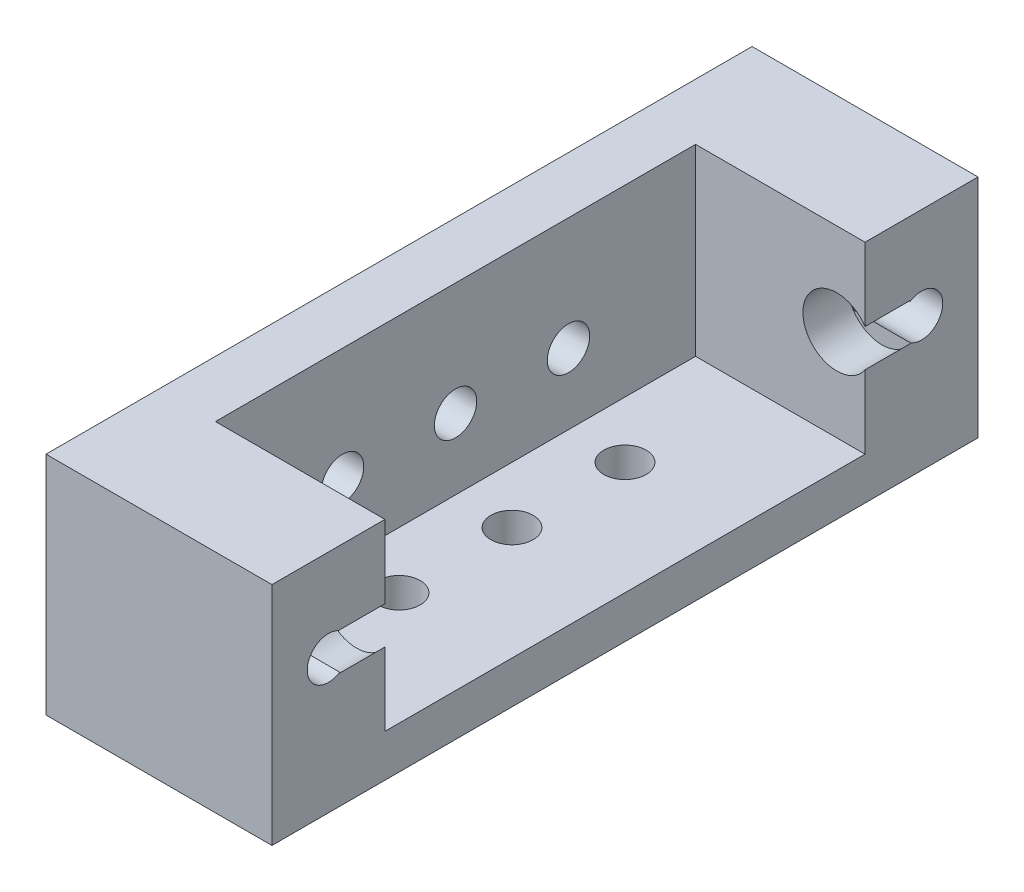
ISO-10303-21;
HEADER;
FILE_DESCRIPTION(('STEP AP214'),'2;1');
FILE_NAME('part.step','',(''),(''),'','','');
FILE_SCHEMA(('AUTOMOTIVE_DESIGN { 1 0 10303 214 1 1 1 1 }'));
ENDSEC;
DATA;
#1=APPLICATION_CONTEXT('core data for automotive mechanical design processes');
#2=APPLICATION_PROTOCOL_DEFINITION('international standard','automotive_design',2000,#1);
#3=PRODUCT_CONTEXT('',#1,'mechanical');
#4=PRODUCT('Part','Part','',(#3));
#5=PRODUCT_RELATED_PRODUCT_CATEGORY('part','',(#4));
#6=PRODUCT_DEFINITION_FORMATION('','',#4);
#7=PRODUCT_DEFINITION_CONTEXT('part definition',#1,'design');
#8=PRODUCT_DEFINITION('design','',#6,#7);
#9=PRODUCT_DEFINITION_SHAPE('','',#8);
#10=(LENGTH_UNIT() NAMED_UNIT(*) SI_UNIT(.MILLI.,.METRE.));
#11=(NAMED_UNIT(*) PLANE_ANGLE_UNIT() SI_UNIT($,.RADIAN.));
#12=(NAMED_UNIT(*) SI_UNIT($,.STERADIAN.) SOLID_ANGLE_UNIT());
#13=UNCERTAINTY_MEASURE_WITH_UNIT(LENGTH_MEASURE(1.E-05),#10,'distance_accuracy_value','');
#14=(GEOMETRIC_REPRESENTATION_CONTEXT(3) GLOBAL_UNCERTAINTY_ASSIGNED_CONTEXT((#13)) GLOBAL_UNIT_ASSIGNED_CONTEXT((#10,
#11,#12)) REPRESENTATION_CONTEXT('',''));
#15=CARTESIAN_POINT('',(0.,0.,0.));
#16=DIRECTION('',(0.,0.,1.));
#17=DIRECTION('',(1.,0.,0.));
#18=AXIS2_PLACEMENT_3D('',#15,#16,#17);
#19=CARTESIAN_POINT('',(25.4,0.,79.375));
#20=DIRECTION('',(-1.,0.,0.));
#21=DIRECTION('',(0.,0.,1.));
#22=AXIS2_PLACEMENT_3D('',#19,#20,#21);
#23=PLANE('',#22);
#24=DIRECTION('',(0.,1.,0.));
#25=VECTOR('',#24,1.);
#26=CARTESIAN_POINT('',(25.4,0.,71.755));
#27=LINE('',#26,#25);
#28=CARTESIAN_POINT('',(25.4,12.9751932581243,71.755));
#29=VERTEX_POINT('',#28);
#30=CARTESIAN_POINT('',(25.4,13.0669383154536,71.755));
#31=VERTEX_POINT('',#30);
#32=EDGE_CURVE('E172',#29,#31,#27,.T.);
#33=ORIENTED_EDGE('',*,*,#32,.T.);
#34=CARTESIAN_POINT('',(25.4,15.08125,73.025));
#35=DIRECTION('',(1.,0.,0.));
#36=DIRECTION('',(0.,0.,-1.));
#37=AXIS2_PLACEMENT_3D('',#34,#35,#36);
#38=CIRCLE('',#37,2.38125000000001);
#39=CARTESIAN_POINT('',(25.4,17.0955616845464,71.755));
#40=VERTEX_POINT('',#39);
#41=EDGE_CURVE('E158',#40,#31,#38,.T.);
#42=ORIENTED_EDGE('',*,*,#41,.F.);
#43=CARTESIAN_POINT('',(25.4,17.1873067418757,71.755));
#44=VERTEX_POINT('',#43);
#45=EDGE_CURVE('E169',#40,#44,#27,.T.);
#46=ORIENTED_EDGE('',*,*,#45,.T.);
#47=DIRECTION('',(0.,0.,-1.));
#48=VECTOR('',#47,1.);
#49=CARTESIAN_POINT('',(25.4,17.1873067418757,87.611307345283));
#50=LINE('',#49,#48);
#51=CARTESIAN_POINT('',(25.4,17.1873067418757,66.675));
#52=VERTEX_POINT('',#51);
#53=EDGE_CURVE('E314',#52,#44,#50,.F.);
#54=ORIENTED_EDGE('',*,*,#53,.F.);
#55=DIRECTION('',(0.,1.,0.));
#56=VECTOR('',#55,1.);
#57=CARTESIAN_POINT('',(25.4,-57.2381264979908,66.675));
#58=LINE('',#57,#56);
#59=CARTESIAN_POINT('',(25.4,25.4,66.675));
#60=VERTEX_POINT('',#59);
#61=EDGE_CURVE('E335',#52,#60,#58,.T.);
#62=ORIENTED_EDGE('',*,*,#61,.T.);
#63=DIRECTION('',(0.,0.,-1.));
#64=VECTOR('',#63,1.);
#65=CARTESIAN_POINT('',(25.4,25.4,79.375));
#66=LINE('',#65,#64);
#67=CARTESIAN_POINT('',(25.4,25.4,79.375));
#68=VERTEX_POINT('',#67);
#69=EDGE_CURVE('E260',#68,#60,#66,.T.);
#70=ORIENTED_EDGE('',*,*,#69,.F.);
#71=DIRECTION('',(0.,1.,0.));
#72=VECTOR('',#71,1.);
#73=CARTESIAN_POINT('',(25.4,0.,79.375));
#74=LINE('',#73,#72);
#75=CARTESIAN_POINT('',(25.4,0.,79.375));
#76=VERTEX_POINT('',#75);
#77=EDGE_CURVE('E259',#76,#68,#74,.T.);
#78=ORIENTED_EDGE('',*,*,#77,.F.);
#79=DIRECTION('',(0.,0.,-1.));
#80=VECTOR('',#79,1.);
#81=CARTESIAN_POINT('',(25.4,0.,79.375));
#82=LINE('',#81,#80);
#83=CARTESIAN_POINT('',(25.4,0.,0.));
#84=VERTEX_POINT('',#83);
#85=EDGE_CURVE('E244',#76,#84,#82,.T.);
#86=ORIENTED_EDGE('',*,*,#85,.T.);
#87=DIRECTION('',(0.,1.,0.));
#88=VECTOR('',#87,1.);
#89=CARTESIAN_POINT('',(25.4,0.,0.));
#90=LINE('',#89,#88);
#91=CARTESIAN_POINT('',(25.4,25.4,0.));
#92=VERTEX_POINT('',#91);
#93=EDGE_CURVE('E252',#84,#92,#90,.T.);
#94=ORIENTED_EDGE('',*,*,#93,.T.);
#95=CARTESIAN_POINT('',(25.4,25.4,12.7));
#96=VERTEX_POINT('',#95);
#97=EDGE_CURVE('E272',#96,#92,#66,.T.);
#98=ORIENTED_EDGE('',*,*,#97,.F.);
#99=DIRECTION('',(0.,1.,0.));
#100=VECTOR('',#99,1.);
#101=CARTESIAN_POINT('',(25.4,-57.2381264979908,12.7));
#102=LINE('',#101,#100);
#103=CARTESIAN_POINT('',(25.4,17.1873067418757,12.7));
#104=VERTEX_POINT('',#103);
#105=EDGE_CURVE('E311',#104,#96,#102,.T.);
#106=ORIENTED_EDGE('',*,*,#105,.F.);
#107=CARTESIAN_POINT('',(25.4,17.1873067418757,7.62));
#108=VERTEX_POINT('',#107);
#109=EDGE_CURVE('E307',#108,#104,#50,.F.);
#110=ORIENTED_EDGE('',*,*,#109,.F.);
#111=DIRECTION('',(0.,1.,0.));
#112=VECTOR('',#111,1.);
#113=CARTESIAN_POINT('',(25.4,0.,7.62));
#114=LINE('',#113,#112);
#115=CARTESIAN_POINT('',(25.4,17.0955616845464,7.62));
#116=VERTEX_POINT('',#115);
#117=EDGE_CURVE('E182',#116,#108,#114,.T.);
#118=ORIENTED_EDGE('',*,*,#117,.F.);
#119=CARTESIAN_POINT('',(25.4,15.08125,6.35));
#120=DIRECTION('',(1.,0.,0.));
#121=DIRECTION('',(0.,0.,-1.));
#122=AXIS2_PLACEMENT_3D('',#119,#120,#121);
#123=CIRCLE('',#122,2.38125);
#124=CARTESIAN_POINT('',(25.4,13.0669383154536,7.62));
#125=VERTEX_POINT('',#124);
#126=EDGE_CURVE('E173',#125,#116,#123,.T.);
#127=ORIENTED_EDGE('',*,*,#126,.F.);
#128=CARTESIAN_POINT('',(25.4,12.9751932581243,7.62));
#129=VERTEX_POINT('',#128);
#130=EDGE_CURVE('E179',#129,#125,#114,.T.);
#131=ORIENTED_EDGE('',*,*,#130,.F.);
#132=DIRECTION('',(0.,0.,-1.));
#133=VECTOR('',#132,1.);
#134=CARTESIAN_POINT('',(25.4,12.9751932581243,87.611307345283));
#135=LINE('',#134,#133);
#136=CARTESIAN_POINT('',(25.4,12.9751932581243,12.7));
#137=VERTEX_POINT('',#136);
#138=EDGE_CURVE('E308',#137,#129,#135,.T.);
#139=ORIENTED_EDGE('',*,*,#138,.F.);
#140=CARTESIAN_POINT('',(25.4,4.7625,12.7));
#141=VERTEX_POINT('',#140);
#142=EDGE_CURVE('E347',#141,#137,#102,.T.);
#143=ORIENTED_EDGE('',*,*,#142,.F.);
#144=DIRECTION('',(0.,0.,1.));
#145=VECTOR('',#144,1.);
#146=CARTESIAN_POINT('',(25.4,4.7625,12.7));
#147=LINE('',#146,#145);
#148=CARTESIAN_POINT('',(25.4,4.7625,66.675));
#149=VERTEX_POINT('',#148);
#150=EDGE_CURVE('E332',#141,#149,#147,.T.);
#151=ORIENTED_EDGE('',*,*,#150,.T.);
#152=CARTESIAN_POINT('',(25.4,12.9751932581243,66.675));
#153=VERTEX_POINT('',#152);
#154=EDGE_CURVE('E329',#149,#153,#58,.T.);
#155=ORIENTED_EDGE('',*,*,#154,.T.);
#156=EDGE_CURVE('E315',#29,#153,#135,.T.);
#157=ORIENTED_EDGE('',*,*,#156,.F.);
#158=EDGE_LOOP('',(#33,#42,#46,#54,#62,#70,#78,#86,#94,#98,#106,#110,#118,#127,#131,#139,#143,
#151,#155,#157));
#159=FACE_BOUND('',#158,.T.);
#160=ADVANCED_FACE('F44',(#159),#23,.F.);
#161=CARTESIAN_POINT('',(0.,0.,79.375));
#162=DIRECTION('',(1.,0.,0.));
#163=DIRECTION('',(0.,0.,-1.));
#164=AXIS2_PLACEMENT_3D('',#161,#162,#163);
#165=PLANE('',#164);
#166=CARTESIAN_POINT('',(0.,12.7,26.9875));
#167=DIRECTION('',(1.,0.,0.));
#168=DIRECTION('',(0.,0.,-1.));
#169=AXIS2_PLACEMENT_3D('',#166,#167,#168);
#170=CIRCLE('',#169,2.38125);
#171=CARTESIAN_POINT('',(0.,12.7,24.60625));
#172=VERTEX_POINT('',#171);
#173=EDGE_CURVE('E290',#172,#172,#170,.T.);
#174=ORIENTED_EDGE('',*,*,#173,.T.);
#175=EDGE_LOOP('',(#174));
#176=FACE_BOUND('',#175,.T.);
#177=CARTESIAN_POINT('',(0.,12.7,39.6875));
#178=DIRECTION('',(1.,0.,0.));
#179=DIRECTION('',(0.,0.,-1.));
#180=AXIS2_PLACEMENT_3D('',#177,#178,#179);
#181=CIRCLE('',#180,2.38125);
#182=CARTESIAN_POINT('',(0.,12.7,37.30625));
#183=VERTEX_POINT('',#182);
#184=EDGE_CURVE('E286',#183,#183,#181,.T.);
#185=ORIENTED_EDGE('',*,*,#184,.T.);
#186=EDGE_LOOP('',(#185));
#187=FACE_BOUND('',#186,.T.);
#188=CARTESIAN_POINT('',(0.,12.7,52.3875));
#189=DIRECTION('',(1.,0.,0.));
#190=DIRECTION('',(0.,0.,-1.));
#191=AXIS2_PLACEMENT_3D('',#188,#189,#190);
#192=CIRCLE('',#191,2.38125);
#193=CARTESIAN_POINT('',(0.,12.7,50.00625));
#194=VERTEX_POINT('',#193);
#195=EDGE_CURVE('E281',#194,#194,#192,.T.);
#196=ORIENTED_EDGE('',*,*,#195,.T.);
#197=EDGE_LOOP('',(#196));
#198=FACE_BOUND('',#197,.T.);
#199=DIRECTION('',(0.,-1.,0.));
#200=VECTOR('',#199,1.);
#201=CARTESIAN_POINT('',(0.,0.,0.));
#202=LINE('',#201,#200);
#203=CARTESIAN_POINT('',(0.,25.4,0.));
#204=VERTEX_POINT('',#203);
#205=CARTESIAN_POINT('',(0.,0.,0.));
#206=VERTEX_POINT('',#205);
#207=EDGE_CURVE('E253',#204,#206,#202,.T.);
#208=ORIENTED_EDGE('',*,*,#207,.T.);
#209=DIRECTION('',(0.,0.,-1.));
#210=VECTOR('',#209,1.);
#211=CARTESIAN_POINT('',(0.,0.,79.375));
#212=LINE('',#211,#210);
#213=CARTESIAN_POINT('',(0.,0.,79.375));
#214=VERTEX_POINT('',#213);
#215=EDGE_CURVE('E247',#214,#206,#212,.T.);
#216=ORIENTED_EDGE('',*,*,#215,.F.);
#217=DIRECTION('',(0.,-1.,0.));
#218=VECTOR('',#217,1.);
#219=CARTESIAN_POINT('',(0.,0.,79.375));
#220=LINE('',#219,#218);
#221=CARTESIAN_POINT('',(0.,25.4,79.375));
#222=VERTEX_POINT('',#221);
#223=EDGE_CURVE('E265',#222,#214,#220,.T.);
#224=ORIENTED_EDGE('',*,*,#223,.F.);
#225=DIRECTION('',(0.,0.,-1.));
#226=VECTOR('',#225,1.);
#227=CARTESIAN_POINT('',(0.,25.4,79.375));
#228=LINE('',#227,#226);
#229=EDGE_CURVE('E269',#222,#204,#228,.T.);
#230=ORIENTED_EDGE('',*,*,#229,.T.);
#231=EDGE_LOOP('',(#208,#216,#224,#230));
#232=FACE_BOUND('',#231,.T.);
#233=ADVANCED_FACE('F46',(#176,#187,#198,#232),#165,.F.);
#234=CARTESIAN_POINT('',(0.,0.,79.375));
#235=DIRECTION('',(0.,1.,0.));
#236=DIRECTION('',(0.,0.,1.));
#237=AXIS2_PLACEMENT_3D('',#234,#235,#236);
#238=PLANE('',#237);
#239=CARTESIAN_POINT('',(12.7,0.,52.3875));
#240=DIRECTION('',(0.,-1.,0.));
#241=DIRECTION('',(0.,0.,-1.));
#242=AXIS2_PLACEMENT_3D('',#239,#240,#241);
#243=CIRCLE('',#242,2.38125);
#244=CARTESIAN_POINT('',(12.7,0.,50.00625));
#245=VERTEX_POINT('',#244);
#246=EDGE_CURVE('E231',#245,#245,#243,.T.);
#247=ORIENTED_EDGE('',*,*,#246,.F.);
#248=EDGE_LOOP('',(#247));
#249=FACE_BOUND('',#248,.T.);
#250=CARTESIAN_POINT('',(12.7,0.,39.6875));
#251=DIRECTION('',(0.,-1.,0.));
#252=DIRECTION('',(0.,0.,-1.));
#253=AXIS2_PLACEMENT_3D('',#250,#251,#252);
#254=CIRCLE('',#253,2.38125);
#255=CARTESIAN_POINT('',(12.7,0.,37.30625));
#256=VERTEX_POINT('',#255);
#257=EDGE_CURVE('E235',#256,#256,#254,.T.);
#258=ORIENTED_EDGE('',*,*,#257,.F.);
#259=EDGE_LOOP('',(#258));
#260=FACE_BOUND('',#259,.T.);
#261=CARTESIAN_POINT('',(12.7,0.,26.9875));
#262=DIRECTION('',(0.,-1.,0.));
#263=DIRECTION('',(0.,0.,-1.));
#264=AXIS2_PLACEMENT_3D('',#261,#262,#263);
#265=CIRCLE('',#264,2.38125);
#266=CARTESIAN_POINT('',(12.7,0.,24.60625));
#267=VERTEX_POINT('',#266);
#268=EDGE_CURVE('E239',#267,#267,#265,.T.);
#269=ORIENTED_EDGE('',*,*,#268,.F.);
#270=EDGE_LOOP('',(#269));
#271=FACE_BOUND('',#270,.T.);
#272=DIRECTION('',(1.,0.,0.));
#273=VECTOR('',#272,1.);
#274=CARTESIAN_POINT('',(0.,0.,0.));
#275=LINE('',#274,#273);
#276=EDGE_CURVE('E242',#206,#84,#275,.T.);
#277=ORIENTED_EDGE('',*,*,#276,.T.);
#278=ORIENTED_EDGE('',*,*,#85,.F.);
#279=DIRECTION('',(1.,0.,0.));
#280=VECTOR('',#279,1.);
#281=CARTESIAN_POINT('',(0.,0.,79.375));
#282=LINE('',#281,#280);
#283=EDGE_CURVE('E354',#214,#76,#282,.T.);
#284=ORIENTED_EDGE('',*,*,#283,.F.);
#285=ORIENTED_EDGE('',*,*,#215,.T.);
#286=EDGE_LOOP('',(#277,#278,#284,#285));
#287=FACE_BOUND('',#286,.T.);
#288=ADVANCED_FACE('F214',(#249,#260,#271,#287),#238,.F.);
#289=CARTESIAN_POINT('',(0.,25.4,79.375));
#290=DIRECTION('',(0.,-1.,0.));
#291=DIRECTION('',(0.,0.,-1.));
#292=AXIS2_PLACEMENT_3D('',#289,#290,#291);
#293=PLANE('',#292);
#294=ORIENTED_EDGE('',*,*,#69,.T.);
#295=DIRECTION('',(1.,0.,0.));
#296=VECTOR('',#295,1.);
#297=CARTESIAN_POINT('',(25.4,25.4,66.675));
#298=LINE('',#297,#296);
#299=CARTESIAN_POINT('',(6.35,25.4,66.675));
#300=VERTEX_POINT('',#299);
#301=EDGE_CURVE('E342',#300,#60,#298,.T.);
#302=ORIENTED_EDGE('',*,*,#301,.F.);
#303=DIRECTION('',(0.,0.,1.));
#304=VECTOR('',#303,1.);
#305=CARTESIAN_POINT('',(6.35,25.4,12.7));
#306=LINE('',#305,#304);
#307=CARTESIAN_POINT('',(6.35,25.4,12.7));
#308=VERTEX_POINT('',#307);
#309=EDGE_CURVE('E367',#308,#300,#306,.T.);
#310=ORIENTED_EDGE('',*,*,#309,.F.);
#311=DIRECTION('',(-1.,0.,0.));
#312=VECTOR('',#311,1.);
#313=CARTESIAN_POINT('',(25.4,25.4,12.7));
#314=LINE('',#313,#312);
#315=EDGE_CURVE('E364',#96,#308,#314,.T.);
#316=ORIENTED_EDGE('',*,*,#315,.F.);
#317=ORIENTED_EDGE('',*,*,#97,.T.);
#318=DIRECTION('',(-1.,0.,0.));
#319=VECTOR('',#318,1.);
#320=CARTESIAN_POINT('',(0.,25.4,0.));
#321=LINE('',#320,#319);
#322=EDGE_CURVE('E263',#92,#204,#321,.T.);
#323=ORIENTED_EDGE('',*,*,#322,.T.);
#324=ORIENTED_EDGE('',*,*,#229,.F.);
#325=DIRECTION('',(-1.,0.,0.));
#326=VECTOR('',#325,1.);
#327=CARTESIAN_POINT('',(0.,25.4,79.375));
#328=LINE('',#327,#326);
#329=EDGE_CURVE('E273',#68,#222,#328,.T.);
#330=ORIENTED_EDGE('',*,*,#329,.F.);
#331=EDGE_LOOP('',(#294,#302,#310,#316,#317,#323,#324,#330));
#332=FACE_BOUND('',#331,.T.);
#333=ADVANCED_FACE('F217',(#332),#293,.F.);
#334=CARTESIAN_POINT('',(0.,0.,79.375));
#335=DIRECTION('',(0.,0.,-1.));
#336=DIRECTION('',(-1.,0.,0.));
#337=AXIS2_PLACEMENT_3D('',#334,#335,#336);
#338=PLANE('',#337);
#339=ORIENTED_EDGE('',*,*,#223,.T.);
#340=ORIENTED_EDGE('',*,*,#283,.T.);
#341=ORIENTED_EDGE('',*,*,#77,.T.);
#342=ORIENTED_EDGE('',*,*,#329,.T.);
#343=EDGE_LOOP('',(#339,#340,#341,#342));
#344=FACE_BOUND('',#343,.T.);
#345=ADVANCED_FACE('F226',(#344),#338,.F.);
#346=CARTESIAN_POINT('',(0.,0.,0.));
#347=DIRECTION('',(0.,0.,-1.));
#348=DIRECTION('',(-1.,0.,0.));
#349=AXIS2_PLACEMENT_3D('',#346,#347,#348);
#350=PLANE('',#349);
#351=ORIENTED_EDGE('',*,*,#207,.F.);
#352=ORIENTED_EDGE('',*,*,#322,.F.);
#353=ORIENTED_EDGE('',*,*,#93,.F.);
#354=ORIENTED_EDGE('',*,*,#276,.F.);
#355=EDGE_LOOP('',(#351,#352,#353,#354));
#356=FACE_BOUND('',#355,.T.);
#357=ADVANCED_FACE('F262',(#356),#350,.T.);
#358=CARTESIAN_POINT('',(25.4,-57.2381264979908,66.675));
#359=DIRECTION('',(0.,0.,1.));
#360=DIRECTION('',(1.,0.,0.));
#361=AXIS2_PLACEMENT_3D('',#358,#359,#360);
#362=PLANE('',#361);
#363=CARTESIAN_POINT('',(22.225,15.08125,66.675));
#364=DIRECTION('',(0.,0.,1.));
#365=DIRECTION('',(1.,0.,0.));
#366=AXIS2_PLACEMENT_3D('',#363,#364,#365);
#367=CIRCLE('',#366,3.81);
#368=EDGE_CURVE('E312',#153,#52,#367,.F.);
#369=ORIENTED_EDGE('',*,*,#368,.F.);
#370=ORIENTED_EDGE('',*,*,#154,.F.);
#371=DIRECTION('',(-1.,0.,0.));
#372=VECTOR('',#371,1.);
#373=CARTESIAN_POINT('',(25.4,4.7625,66.675));
#374=LINE('',#373,#372);
#375=CARTESIAN_POINT('',(6.35,4.7625,66.675));
#376=VERTEX_POINT('',#375);
#377=EDGE_CURVE('E337',#149,#376,#374,.T.);
#378=ORIENTED_EDGE('',*,*,#377,.T.);
#379=DIRECTION('',(0.,1.,0.));
#380=VECTOR('',#379,1.);
#381=CARTESIAN_POINT('',(6.35,-57.2381264979908,66.675));
#382=LINE('',#381,#380);
#383=EDGE_CURVE('E339',#376,#300,#382,.T.);
#384=ORIENTED_EDGE('',*,*,#383,.T.);
#385=ORIENTED_EDGE('',*,*,#301,.T.);
#386=ORIENTED_EDGE('',*,*,#61,.F.);
#387=EDGE_LOOP('',(#369,#370,#378,#384,#385,#386));
#388=FACE_BOUND('',#387,.T.);
#389=ADVANCED_FACE('F416',(#388),#362,.F.);
#390=CARTESIAN_POINT('',(6.35,-57.2381264979908,12.7));
#391=DIRECTION('',(-1.,0.,0.));
#392=DIRECTION('',(0.,0.,1.));
#393=AXIS2_PLACEMENT_3D('',#390,#391,#392);
#394=PLANE('',#393);
#395=CARTESIAN_POINT('',(6.35,12.7,26.9875));
#396=DIRECTION('',(-1.,0.,0.));
#397=DIRECTION('',(0.,0.,1.));
#398=AXIS2_PLACEMENT_3D('',#395,#396,#397);
#399=CIRCLE('',#398,2.38125);
#400=CARTESIAN_POINT('',(6.35,12.7,29.36875));
#401=VERTEX_POINT('',#400);
#402=EDGE_CURVE('E287',#401,#401,#399,.T.);
#403=ORIENTED_EDGE('',*,*,#402,.T.);
#404=EDGE_LOOP('',(#403));
#405=FACE_BOUND('',#404,.T.);
#406=CARTESIAN_POINT('',(6.35,12.7,39.6875));
#407=DIRECTION('',(-1.,0.,0.));
#408=DIRECTION('',(0.,0.,1.));
#409=AXIS2_PLACEMENT_3D('',#406,#407,#408);
#410=CIRCLE('',#409,2.38125);
#411=CARTESIAN_POINT('',(6.35,12.7,42.06875));
#412=VERTEX_POINT('',#411);
#413=EDGE_CURVE('E283',#412,#412,#410,.T.);
#414=ORIENTED_EDGE('',*,*,#413,.T.);
#415=EDGE_LOOP('',(#414));
#416=FACE_BOUND('',#415,.T.);
#417=CARTESIAN_POINT('',(6.35,12.7,52.3875));
#418=DIRECTION('',(-1.,0.,0.));
#419=DIRECTION('',(0.,0.,1.));
#420=AXIS2_PLACEMENT_3D('',#417,#418,#419);
#421=CIRCLE('',#420,2.38125);
#422=CARTESIAN_POINT('',(6.35,12.7,54.76875));
#423=VERTEX_POINT('',#422);
#424=EDGE_CURVE('E278',#423,#423,#421,.T.);
#425=ORIENTED_EDGE('',*,*,#424,.T.);
#426=EDGE_LOOP('',(#425));
#427=FACE_BOUND('',#426,.T.);
#428=DIRECTION('',(0.,0.,-1.));
#429=VECTOR('',#428,1.);
#430=CARTESIAN_POINT('',(6.35,4.7625,12.7));
#431=LINE('',#430,#429);
#432=CARTESIAN_POINT('',(6.35,4.7625,12.7));
#433=VERTEX_POINT('',#432);
#434=EDGE_CURVE('E334',#376,#433,#431,.T.);
#435=ORIENTED_EDGE('',*,*,#434,.T.);
#436=DIRECTION('',(0.,1.,0.));
#437=VECTOR('',#436,1.);
#438=CARTESIAN_POINT('',(6.35,-57.2381264979908,12.7));
#439=LINE('',#438,#437);
#440=EDGE_CURVE('E345',#433,#308,#439,.T.);
#441=ORIENTED_EDGE('',*,*,#440,.T.);
#442=ORIENTED_EDGE('',*,*,#309,.T.);
#443=ORIENTED_EDGE('',*,*,#383,.F.);
#444=EDGE_LOOP('',(#435,#441,#442,#443));
#445=FACE_BOUND('',#444,.T.);
#446=ADVANCED_FACE('F418',(#405,#416,#427,#445),#394,.F.);
#447=CARTESIAN_POINT('',(25.4,-57.2381264979908,12.7));
#448=DIRECTION('',(0.,0.,-1.));
#449=DIRECTION('',(-1.,0.,0.));
#450=AXIS2_PLACEMENT_3D('',#447,#448,#449);
#451=PLANE('',#450);
#452=CARTESIAN_POINT('',(22.225,15.08125,12.7));
#453=DIRECTION('',(0.,0.,-1.));
#454=DIRECTION('',(-1.,0.,0.));
#455=AXIS2_PLACEMENT_3D('',#452,#453,#454);
#456=CIRCLE('',#455,3.81);
#457=EDGE_CURVE('E277',#104,#137,#456,.F.);
#458=ORIENTED_EDGE('',*,*,#457,.F.);
#459=ORIENTED_EDGE('',*,*,#105,.T.);
#460=ORIENTED_EDGE('',*,*,#315,.T.);
#461=ORIENTED_EDGE('',*,*,#440,.F.);
#462=DIRECTION('',(1.,0.,0.));
#463=VECTOR('',#462,1.);
#464=CARTESIAN_POINT('',(25.4,4.7625,12.7));
#465=LINE('',#464,#463);
#466=EDGE_CURVE('E350',#433,#141,#465,.T.);
#467=ORIENTED_EDGE('',*,*,#466,.T.);
#468=ORIENTED_EDGE('',*,*,#142,.T.);
#469=EDGE_LOOP('',(#458,#459,#460,#461,#467,#468));
#470=FACE_BOUND('',#469,.T.);
#471=ADVANCED_FACE('F414',(#470),#451,.F.);
#472=CARTESIAN_POINT('',(0.,4.7625,79.375));
#473=DIRECTION('',(0.,1.,0.));
#474=DIRECTION('',(0.,0.,1.));
#475=AXIS2_PLACEMENT_3D('',#472,#473,#474);
#476=PLANE('',#475);
#477=CARTESIAN_POINT('',(12.7,4.7625,52.3875));
#478=DIRECTION('',(0.,1.,0.));
#479=DIRECTION('',(0.,0.,1.));
#480=AXIS2_PLACEMENT_3D('',#477,#478,#479);
#481=CIRCLE('',#480,2.38125);
#482=CARTESIAN_POINT('',(12.7,4.7625,54.76875));
#483=VERTEX_POINT('',#482);
#484=EDGE_CURVE('E282',#483,#483,#481,.T.);
#485=ORIENTED_EDGE('',*,*,#484,.F.);
#486=EDGE_LOOP('',(#485));
#487=FACE_BOUND('',#486,.T.);
#488=CARTESIAN_POINT('',(12.7,4.7625,39.6875));
#489=DIRECTION('',(0.,1.,0.));
#490=DIRECTION('',(0.,0.,1.));
#491=AXIS2_PLACEMENT_3D('',#488,#489,#490);
#492=CIRCLE('',#491,2.38125);
#493=CARTESIAN_POINT('',(12.7,4.7625,42.06875));
#494=VERTEX_POINT('',#493);
#495=EDGE_CURVE('E294',#494,#494,#492,.T.);
#496=ORIENTED_EDGE('',*,*,#495,.F.);
#497=EDGE_LOOP('',(#496));
#498=FACE_BOUND('',#497,.T.);
#499=CARTESIAN_POINT('',(12.7,4.7625,26.9875));
#500=DIRECTION('',(0.,1.,0.));
#501=DIRECTION('',(0.,0.,1.));
#502=AXIS2_PLACEMENT_3D('',#499,#500,#501);
#503=CIRCLE('',#502,2.38125);
#504=CARTESIAN_POINT('',(12.7,4.7625,29.36875));
#505=VERTEX_POINT('',#504);
#506=EDGE_CURVE('E291',#505,#505,#503,.T.);
#507=ORIENTED_EDGE('',*,*,#506,.F.);
#508=EDGE_LOOP('',(#507));
#509=FACE_BOUND('',#508,.T.);
#510=ORIENTED_EDGE('',*,*,#150,.F.);
#511=ORIENTED_EDGE('',*,*,#466,.F.);
#512=ORIENTED_EDGE('',*,*,#434,.F.);
#513=ORIENTED_EDGE('',*,*,#377,.F.);
#514=EDGE_LOOP('',(#510,#511,#512,#513));
#515=FACE_BOUND('',#514,.T.);
#516=ADVANCED_FACE('F411',(#487,#498,#509,#515),#476,.T.);
#517=CARTESIAN_POINT('',(25.4,12.7,52.3875));
#518=DIRECTION('',(-1.,0.,0.));
#519=DIRECTION('',(0.,0.,1.));
#520=AXIS2_PLACEMENT_3D('',#517,#518,#519);
#521=CYLINDRICAL_SURFACE('',#520,2.38125);
#522=ORIENTED_EDGE('',*,*,#424,.F.);
#523=EDGE_LOOP('',(#522));
#524=FACE_BOUND('',#523,.T.);
#525=ORIENTED_EDGE('',*,*,#195,.F.);
#526=EDGE_LOOP('',(#525));
#527=FACE_BOUND('',#526,.T.);
#528=ADVANCED_FACE('F407',(#524,#527),#521,.F.);
#529=CARTESIAN_POINT('',(25.4,12.7,39.6875));
#530=DIRECTION('',(-1.,0.,0.));
#531=DIRECTION('',(0.,0.,1.));
#532=AXIS2_PLACEMENT_3D('',#529,#530,#531);
#533=CYLINDRICAL_SURFACE('',#532,2.38125);
#534=ORIENTED_EDGE('',*,*,#413,.F.);
#535=EDGE_LOOP('',(#534));
#536=FACE_BOUND('',#535,.T.);
#537=ORIENTED_EDGE('',*,*,#184,.F.);
#538=EDGE_LOOP('',(#537));
#539=FACE_BOUND('',#538,.T.);
#540=ADVANCED_FACE('F403',(#536,#539),#533,.F.);
#541=CARTESIAN_POINT('',(25.4,12.7,26.9875));
#542=DIRECTION('',(-1.,0.,0.));
#543=DIRECTION('',(0.,0.,1.));
#544=AXIS2_PLACEMENT_3D('',#541,#542,#543);
#545=CYLINDRICAL_SURFACE('',#544,2.38125);
#546=ORIENTED_EDGE('',*,*,#402,.F.);
#547=EDGE_LOOP('',(#546));
#548=FACE_BOUND('',#547,.T.);
#549=ORIENTED_EDGE('',*,*,#173,.F.);
#550=EDGE_LOOP('',(#549));
#551=FACE_BOUND('',#550,.T.);
#552=ADVANCED_FACE('F400',(#548,#551),#545,.F.);
#553=CARTESIAN_POINT('',(12.7,25.4,26.9875));
#554=DIRECTION('',(0.,-1.,0.));
#555=DIRECTION('',(0.,0.,-1.));
#556=AXIS2_PLACEMENT_3D('',#553,#554,#555);
#557=CYLINDRICAL_SURFACE('',#556,2.38125);
#558=ORIENTED_EDGE('',*,*,#506,.T.);
#559=EDGE_LOOP('',(#558));
#560=FACE_BOUND('',#559,.T.);
#561=ORIENTED_EDGE('',*,*,#268,.T.);
#562=EDGE_LOOP('',(#561));
#563=FACE_BOUND('',#562,.T.);
#564=ADVANCED_FACE('F393',(#560,#563),#557,.F.);
#565=CARTESIAN_POINT('',(12.7,25.4,39.6875));
#566=DIRECTION('',(0.,-1.,0.));
#567=DIRECTION('',(0.,0.,-1.));
#568=AXIS2_PLACEMENT_3D('',#565,#566,#567);
#569=CYLINDRICAL_SURFACE('',#568,2.38125);
#570=ORIENTED_EDGE('',*,*,#495,.T.);
#571=EDGE_LOOP('',(#570));
#572=FACE_BOUND('',#571,.T.);
#573=ORIENTED_EDGE('',*,*,#257,.T.);
#574=EDGE_LOOP('',(#573));
#575=FACE_BOUND('',#574,.T.);
#576=ADVANCED_FACE('F384',(#572,#575),#569,.F.);
#577=CARTESIAN_POINT('',(12.7,25.4,52.3875));
#578=DIRECTION('',(0.,-1.,0.));
#579=DIRECTION('',(0.,0.,-1.));
#580=AXIS2_PLACEMENT_3D('',#577,#578,#579);
#581=CYLINDRICAL_SURFACE('',#580,2.38125);
#582=ORIENTED_EDGE('',*,*,#484,.T.);
#583=EDGE_LOOP('',(#582));
#584=FACE_BOUND('',#583,.T.);
#585=ORIENTED_EDGE('',*,*,#246,.T.);
#586=EDGE_LOOP('',(#585));
#587=FACE_BOUND('',#586,.T.);
#588=ADVANCED_FACE('F382',(#584,#587),#581,.F.);
#589=CARTESIAN_POINT('',(22.225,15.08125,87.611307345283));
#590=DIRECTION('',(0.,0.,-1.));
#591=DIRECTION('',(-1.,0.,0.));
#592=AXIS2_PLACEMENT_3D('',#589,#590,#591);
#593=CYLINDRICAL_SURFACE('',#592,3.81);
#594=ORIENTED_EDGE('',*,*,#109,.T.);
#595=ORIENTED_EDGE('',*,*,#457,.T.);
#596=ORIENTED_EDGE('',*,*,#138,.T.);
#597=CARTESIAN_POINT('',(22.225,15.08125,7.62));
#598=DIRECTION('',(0.,0.,1.));
#599=DIRECTION('',(1.,0.,0.));
#600=AXIS2_PLACEMENT_3D('',#597,#598,#599);
#601=CIRCLE('',#600,3.81);
#602=EDGE_CURVE('E303',#108,#129,#601,.T.);
#603=ORIENTED_EDGE('',*,*,#602,.F.);
#604=EDGE_LOOP('',(#594,#595,#596,#603));
#605=FACE_BOUND('',#604,.T.);
#606=ADVANCED_FACE('F306',(#605),#593,.F.);
#607=CARTESIAN_POINT('',(22.225,15.08125,7.62));
#608=DIRECTION('',(0.,0.,1.));
#609=DIRECTION('',(1.,0.,0.));
#610=AXIS2_PLACEMENT_3D('',#607,#608,#609);
#611=PLANE('',#610);
#612=DIRECTION('',(1.,0.,0.));
#613=VECTOR('',#612,1.);
#614=CARTESIAN_POINT('',(19.05,13.0669383154536,7.62));
#615=LINE('',#614,#613);
#616=CARTESIAN_POINT('',(19.05,13.0669383154536,7.62));
#617=VERTEX_POINT('',#616);
#618=EDGE_CURVE('E13',#617,#125,#615,.T.);
#619=ORIENTED_EDGE('',*,*,#618,.F.);
#620=DIRECTION('',(0.,1.,0.));
#621=VECTOR('',#620,1.);
#622=CARTESIAN_POINT('',(19.05,15.08125,7.62));
#623=LINE('',#622,#621);
#624=CARTESIAN_POINT('',(19.05,17.0955616845464,7.62));
#625=VERTEX_POINT('',#624);
#626=EDGE_CURVE('E188',#617,#625,#623,.T.);
#627=ORIENTED_EDGE('',*,*,#626,.T.);
#628=DIRECTION('',(1.,0.,0.));
#629=VECTOR('',#628,1.);
#630=CARTESIAN_POINT('',(19.05,17.0955616845464,7.62));
#631=LINE('',#630,#629);
#632=EDGE_CURVE('E52',#116,#625,#631,.F.);
#633=ORIENTED_EDGE('',*,*,#632,.F.);
#634=ORIENTED_EDGE('',*,*,#117,.T.);
#635=ORIENTED_EDGE('',*,*,#602,.T.);
#636=ORIENTED_EDGE('',*,*,#130,.T.);
#637=EDGE_LOOP('',(#619,#627,#633,#634,#635,#636));
#638=FACE_BOUND('',#637,.T.);
#639=ADVANCED_FACE('F197',(#638),#611,.T.);
#640=CARTESIAN_POINT('',(25.4,-57.2381264979908,71.755));
#641=DIRECTION('',(0.,0.,1.));
#642=DIRECTION('',(1.,0.,0.));
#643=AXIS2_PLACEMENT_3D('',#640,#641,#642);
#644=PLANE('',#643);
#645=DIRECTION('',(0.,1.,0.));
#646=VECTOR('',#645,1.);
#647=CARTESIAN_POINT('',(19.05,-57.2381264979908,71.755));
#648=LINE('',#647,#646);
#649=CARTESIAN_POINT('',(19.05,13.0669383154536,71.755));
#650=VERTEX_POINT('',#649);
#651=CARTESIAN_POINT('',(19.05,17.0955616845464,71.755));
#652=VERTEX_POINT('',#651);
#653=EDGE_CURVE('E164',#650,#652,#648,.T.);
#654=ORIENTED_EDGE('',*,*,#653,.F.);
#655=DIRECTION('',(1.,0.,0.));
#656=VECTOR('',#655,1.);
#657=CARTESIAN_POINT('',(19.05,13.0669383154536,71.755));
#658=LINE('',#657,#656);
#659=EDGE_CURVE('E163',#650,#31,#658,.T.);
#660=ORIENTED_EDGE('',*,*,#659,.T.);
#661=ORIENTED_EDGE('',*,*,#32,.F.);
#662=CARTESIAN_POINT('',(22.225,15.08125,71.755));
#663=DIRECTION('',(0.,0.,1.));
#664=DIRECTION('',(1.,0.,0.));
#665=AXIS2_PLACEMENT_3D('',#662,#663,#664);
#666=CIRCLE('',#665,3.81);
#667=EDGE_CURVE('E178',#44,#29,#666,.T.);
#668=ORIENTED_EDGE('',*,*,#667,.F.);
#669=ORIENTED_EDGE('',*,*,#45,.F.);
#670=DIRECTION('',(1.,0.,0.));
#671=VECTOR('',#670,1.);
#672=CARTESIAN_POINT('',(19.05,17.0955616845464,71.755));
#673=LINE('',#672,#671);
#674=EDGE_CURVE('E155',#40,#652,#673,.F.);
#675=ORIENTED_EDGE('',*,*,#674,.T.);
#676=EDGE_LOOP('',(#654,#660,#661,#668,#669,#675));
#677=FACE_BOUND('',#676,.T.);
#678=ADVANCED_FACE('F176',(#677),#644,.F.);
#679=ORIENTED_EDGE('',*,*,#53,.T.);
#680=ORIENTED_EDGE('',*,*,#667,.T.);
#681=ORIENTED_EDGE('',*,*,#156,.T.);
#682=ORIENTED_EDGE('',*,*,#368,.T.);
#683=EDGE_LOOP('',(#679,#680,#681,#682));
#684=FACE_BOUND('',#683,.T.);
#685=ADVANCED_FACE('F325',(#684),#593,.F.);
#686=CARTESIAN_POINT('',(19.05,15.08125,73.025));
#687=DIRECTION('',(1.,0.,0.));
#688=DIRECTION('',(0.,0.,-1.));
#689=AXIS2_PLACEMENT_3D('',#686,#687,#688);
#690=CYLINDRICAL_SURFACE('',#689,2.38125000000001);
#691=CARTESIAN_POINT('',(19.05,15.08125,73.025));
#692=DIRECTION('',(1.,0.,0.));
#693=DIRECTION('',(0.,0.,-1.));
#694=AXIS2_PLACEMENT_3D('',#691,#692,#693);
#695=CIRCLE('',#694,2.38125000000001);
#696=EDGE_CURVE('E65',#652,#650,#695,.T.);
#697=ORIENTED_EDGE('',*,*,#696,.F.);
#698=ORIENTED_EDGE('',*,*,#674,.F.);
#699=ORIENTED_EDGE('',*,*,#41,.T.);
#700=ORIENTED_EDGE('',*,*,#659,.F.);
#701=EDGE_LOOP('',(#697,#698,#699,#700));
#702=FACE_BOUND('',#701,.T.);
#703=ADVANCED_FACE('F157',(#702),#690,.F.);
#704=CARTESIAN_POINT('',(19.05,15.08125,73.025));
#705=DIRECTION('',(1.,0.,0.));
#706=DIRECTION('',(0.,0.,-1.));
#707=AXIS2_PLACEMENT_3D('',#704,#705,#706);
#708=PLANE('',#707);
#709=ORIENTED_EDGE('',*,*,#653,.T.);
#710=ORIENTED_EDGE('',*,*,#696,.T.);
#711=EDGE_LOOP('',(#709,#710));
#712=FACE_BOUND('',#711,.T.);
#713=ADVANCED_FACE('F204',(#712),#708,.T.);
#714=CARTESIAN_POINT('',(19.05,15.08125,6.35));
#715=DIRECTION('',(1.,0.,0.));
#716=DIRECTION('',(0.,0.,-1.));
#717=AXIS2_PLACEMENT_3D('',#714,#715,#716);
#718=CYLINDRICAL_SURFACE('',#717,2.38125);
#719=ORIENTED_EDGE('',*,*,#618,.T.);
#720=ORIENTED_EDGE('',*,*,#126,.T.);
#721=ORIENTED_EDGE('',*,*,#632,.T.);
#722=CARTESIAN_POINT('',(19.05,15.08125,6.35));
#723=DIRECTION('',(1.,0.,0.));
#724=DIRECTION('',(0.,0.,-1.));
#725=AXIS2_PLACEMENT_3D('',#722,#723,#724);
#726=CIRCLE('',#725,2.38125);
#727=EDGE_CURVE('E58',#617,#625,#726,.T.);
#728=ORIENTED_EDGE('',*,*,#727,.F.);
#729=EDGE_LOOP('',(#719,#720,#721,#728));
#730=FACE_BOUND('',#729,.T.);
#731=ADVANCED_FACE('F192',(#730),#718,.F.);
#732=CARTESIAN_POINT('',(19.05,15.08125,6.35));
#733=DIRECTION('',(1.,0.,0.));
#734=DIRECTION('',(0.,0.,-1.));
#735=AXIS2_PLACEMENT_3D('',#732,#733,#734);
#736=PLANE('',#735);
#737=ORIENTED_EDGE('',*,*,#727,.T.);
#738=ORIENTED_EDGE('',*,*,#626,.F.);
#739=EDGE_LOOP('',(#737,#738));
#740=FACE_BOUND('',#739,.T.);
#741=ADVANCED_FACE('F198',(#740),#736,.T.);
#742=CLOSED_SHELL('',(#160,#233,#288,#333,#345,#357,#389,#446,#471,#516,#528,#540,#552,#564,
#576,#588,#606,#639,#678,#685,#703,#713,#731,#741));
#743=MANIFOLD_SOLID_BREP('B2',#742);
#744=ADVANCED_BREP_SHAPE_REPRESENTATION('',(#18,#743),#14);
#745=SHAPE_DEFINITION_REPRESENTATION(#9,#744);
ENDSEC;
END-ISO-10303-21;
